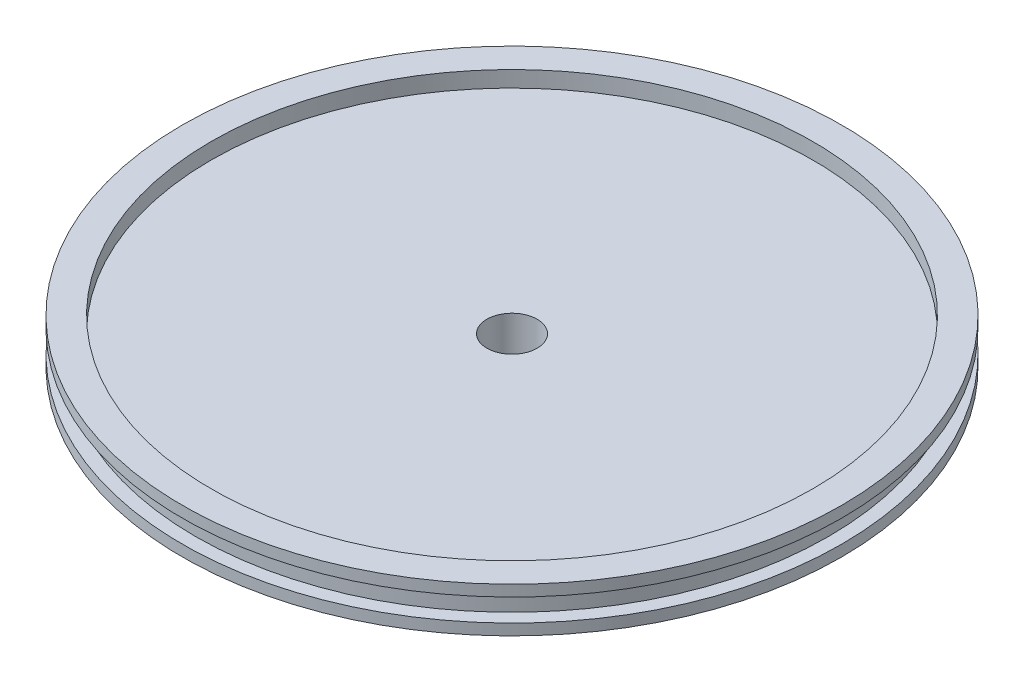
ISO-10303-21;
HEADER;
FILE_DESCRIPTION(('STEP AP214'),'2;1');
FILE_NAME('part.step','',(''),(''),'','','');
FILE_SCHEMA(('AUTOMOTIVE_DESIGN { 1 0 10303 214 1 1 1 1 }'));
ENDSEC;
DATA;
#1=APPLICATION_CONTEXT('core data for automotive mechanical design processes');
#2=APPLICATION_PROTOCOL_DEFINITION('international standard','automotive_design',2000,#1);
#3=PRODUCT_CONTEXT('',#1,'mechanical');
#4=PRODUCT('Part','Part','',(#3));
#5=PRODUCT_RELATED_PRODUCT_CATEGORY('part','',(#4));
#6=PRODUCT_DEFINITION_FORMATION('','',#4);
#7=PRODUCT_DEFINITION_CONTEXT('part definition',#1,'design');
#8=PRODUCT_DEFINITION('design','',#6,#7);
#9=PRODUCT_DEFINITION_SHAPE('','',#8);
#10=(LENGTH_UNIT() NAMED_UNIT(*) SI_UNIT(.MILLI.,.METRE.));
#11=(NAMED_UNIT(*) PLANE_ANGLE_UNIT() SI_UNIT($,.RADIAN.));
#12=(NAMED_UNIT(*) SI_UNIT($,.STERADIAN.) SOLID_ANGLE_UNIT());
#13=UNCERTAINTY_MEASURE_WITH_UNIT(LENGTH_MEASURE(1.E-05),#10,'distance_accuracy_value','');
#14=(GEOMETRIC_REPRESENTATION_CONTEXT(3) GLOBAL_UNCERTAINTY_ASSIGNED_CONTEXT((#13)) GLOBAL_UNIT_ASSIGNED_CONTEXT((#10,
#11,#12)) REPRESENTATION_CONTEXT('',''));
#15=CARTESIAN_POINT('',(0.,0.,0.));
#16=DIRECTION('',(0.,0.,1.));
#17=DIRECTION('',(1.,0.,0.));
#18=AXIS2_PLACEMENT_3D('',#15,#16,#17);
#19=CARTESIAN_POINT('',(0.,-2.54,0.));
#20=DIRECTION('',(0.,-1.,0.));
#21=DIRECTION('',(1.,0.,0.));
#22=AXIS2_PLACEMENT_3D('',#19,#20,#21);
#23=PLANE('',#22);
#24=CARTESIAN_POINT('',(0.,-2.54,0.));
#25=DIRECTION('',(0.,-1.,0.));
#26=DIRECTION('',(1.,0.,0.));
#27=AXIS2_PLACEMENT_3D('',#24,#25,#26);
#28=CIRCLE('',#27,66.04);
#29=CARTESIAN_POINT('',(66.04,-2.53999999999999,0.));
#30=VERTEX_POINT('',#29);
#31=EDGE_CURVE('E60',#30,#30,#28,.T.);
#32=ORIENTED_EDGE('',*,*,#31,.T.);
#33=EDGE_LOOP('',(#32));
#34=FACE_BOUND('',#33,.T.);
#35=CARTESIAN_POINT('',(0.,-2.54,0.));
#36=DIRECTION('',(0.,1.,0.));
#37=DIRECTION('',(0.,0.,1.));
#38=AXIS2_PLACEMENT_3D('',#35,#36,#37);
#39=CIRCLE('',#38,5.5626);
#40=CARTESIAN_POINT('',(0.,-2.54,5.5626));
#41=VERTEX_POINT('',#40);
#42=EDGE_CURVE('E202',#41,#41,#39,.T.);
#43=ORIENTED_EDGE('',*,*,#42,.T.);
#44=EDGE_LOOP('',(#43));
#45=FACE_BOUND('',#44,.T.);
#46=ADVANCED_FACE('F43',(#34,#45),#23,.T.);
#47=CARTESIAN_POINT('',(0.,0.,0.));
#48=DIRECTION('',(0.,1.,0.));
#49=DIRECTION('',(-1.,0.,0.));
#50=AXIS2_PLACEMENT_3D('',#47,#48,#49);
#51=PLANE('',#50);
#52=CARTESIAN_POINT('',(0.,0.,0.));
#53=DIRECTION('',(0.,-1.,0.));
#54=DIRECTION('',(1.,0.,0.));
#55=AXIS2_PLACEMENT_3D('',#52,#53,#54);
#56=CIRCLE('',#55,66.04);
#57=CARTESIAN_POINT('',(66.04,0.,0.));
#58=VERTEX_POINT('',#57);
#59=EDGE_CURVE('E10',#58,#58,#56,.T.);
#60=ORIENTED_EDGE('',*,*,#59,.F.);
#61=EDGE_LOOP('',(#60));
#62=FACE_BOUND('',#61,.T.);
#63=CARTESIAN_POINT('',(0.,0.,0.));
#64=DIRECTION('',(0.,1.,0.));
#65=DIRECTION('',(-1.,0.,0.));
#66=AXIS2_PLACEMENT_3D('',#63,#64,#65);
#67=CIRCLE('',#66,72.898);
#68=CARTESIAN_POINT('',(-72.898,0.,0.));
#69=VERTEX_POINT('',#68);
#70=EDGE_CURVE('E47',#69,#69,#67,.T.);
#71=ORIENTED_EDGE('',*,*,#70,.F.);
#72=EDGE_LOOP('',(#71));
#73=FACE_BOUND('',#72,.T.);
#74=ADVANCED_FACE('F45',(#62,#73),#51,.F.);
#75=CARTESIAN_POINT('',(0.,48.1922132313012,0.));
#76=DIRECTION('',(0.,1.,0.));
#77=DIRECTION('',(-1.,0.,0.));
#78=AXIS2_PLACEMENT_3D('',#75,#76,#77);
#79=CYLINDRICAL_SURFACE('',#78,72.898);
#80=CARTESIAN_POINT('',(0.,2.4638,0.));
#81=DIRECTION('',(0.,1.,0.));
#82=DIRECTION('',(-1.,0.,0.));
#83=AXIS2_PLACEMENT_3D('',#80,#81,#82);
#84=CIRCLE('',#83,72.898);
#85=CARTESIAN_POINT('',(-72.898,2.46379999999999,0.));
#86=VERTEX_POINT('',#85);
#87=EDGE_CURVE('E57',#86,#86,#84,.T.);
#88=ORIENTED_EDGE('',*,*,#87,.F.);
#89=EDGE_LOOP('',(#88));
#90=FACE_BOUND('',#89,.T.);
#91=ORIENTED_EDGE('',*,*,#70,.T.);
#92=EDGE_LOOP('',(#91));
#93=FACE_BOUND('',#92,.T.);
#94=ADVANCED_FACE('F91',(#90,#93),#79,.T.);
#95=CARTESIAN_POINT('',(72.898,2.4638,0.));
#96=DIRECTION('',(0.,-1.,0.));
#97=DIRECTION('',(1.,0.,0.));
#98=AXIS2_PLACEMENT_3D('',#95,#96,#97);
#99=PLANE('',#98);
#100=CARTESIAN_POINT('',(0.,2.4638,0.));
#101=DIRECTION('',(0.,1.,0.));
#102=DIRECTION('',(-1.,0.,0.));
#103=AXIS2_PLACEMENT_3D('',#100,#101,#102);
#104=CIRCLE('',#103,69.977);
#105=CARTESIAN_POINT('',(-69.977,2.46379999999999,0.));
#106=VERTEX_POINT('',#105);
#107=EDGE_CURVE('E82',#106,#106,#104,.T.);
#108=ORIENTED_EDGE('',*,*,#107,.F.);
#109=EDGE_LOOP('',(#108));
#110=FACE_BOUND('',#109,.T.);
#111=ORIENTED_EDGE('',*,*,#87,.T.);
#112=EDGE_LOOP('',(#111));
#113=FACE_BOUND('',#112,.T.);
#114=ADVANCED_FACE('F89',(#110,#113),#99,.F.);
#115=CARTESIAN_POINT('',(0.,48.1922132313012,0.));
#116=DIRECTION('',(0.,1.,0.));
#117=DIRECTION('',(-1.,0.,0.));
#118=AXIS2_PLACEMENT_3D('',#115,#116,#117);
#119=CYLINDRICAL_SURFACE('',#118,69.977);
#120=CARTESIAN_POINT('',(0.,7.44219999999999,0.));
#121=DIRECTION('',(0.,1.,0.));
#122=DIRECTION('',(-1.,0.,0.));
#123=AXIS2_PLACEMENT_3D('',#120,#121,#122);
#124=CIRCLE('',#123,69.977);
#125=CARTESIAN_POINT('',(-69.977,7.44219999999998,0.));
#126=VERTEX_POINT('',#125);
#127=EDGE_CURVE('E78',#126,#126,#124,.T.);
#128=ORIENTED_EDGE('',*,*,#127,.F.);
#129=EDGE_LOOP('',(#128));
#130=FACE_BOUND('',#129,.T.);
#131=ORIENTED_EDGE('',*,*,#107,.T.);
#132=EDGE_LOOP('',(#131));
#133=FACE_BOUND('',#132,.T.);
#134=ADVANCED_FACE('F133',(#130,#133),#119,.T.);
#135=CARTESIAN_POINT('',(69.977,7.4422,0.));
#136=DIRECTION('',(0.,1.,0.));
#137=DIRECTION('',(-1.,0.,0.));
#138=AXIS2_PLACEMENT_3D('',#135,#136,#137);
#139=PLANE('',#138);
#140=CARTESIAN_POINT('',(0.,7.44219999999999,0.));
#141=DIRECTION('',(0.,1.,0.));
#142=DIRECTION('',(-1.,0.,0.));
#143=AXIS2_PLACEMENT_3D('',#140,#141,#142);
#144=CIRCLE('',#143,72.898);
#145=CARTESIAN_POINT('',(-72.898,7.44219999999998,0.));
#146=VERTEX_POINT('',#145);
#147=EDGE_CURVE('E74',#146,#146,#144,.T.);
#148=ORIENTED_EDGE('',*,*,#147,.F.);
#149=EDGE_LOOP('',(#148));
#150=FACE_BOUND('',#149,.T.);
#151=ORIENTED_EDGE('',*,*,#127,.T.);
#152=EDGE_LOOP('',(#151));
#153=FACE_BOUND('',#152,.T.);
#154=ADVANCED_FACE('F129',(#150,#153),#139,.F.);
#155=CARTESIAN_POINT('',(0.,48.1922132313012,0.));
#156=DIRECTION('',(0.,1.,0.));
#157=DIRECTION('',(-1.,0.,0.));
#158=AXIS2_PLACEMENT_3D('',#155,#156,#157);
#159=CYLINDRICAL_SURFACE('',#158,72.898);
#160=CARTESIAN_POINT('',(0.,9.90599999999999,0.));
#161=DIRECTION('',(0.,1.,0.));
#162=DIRECTION('',(-1.,0.,0.));
#163=AXIS2_PLACEMENT_3D('',#160,#161,#162);
#164=CIRCLE('',#163,72.898);
#165=CARTESIAN_POINT('',(-72.898,9.90599999999998,0.));
#166=VERTEX_POINT('',#165);
#167=EDGE_CURVE('E70',#166,#166,#164,.T.);
#168=ORIENTED_EDGE('',*,*,#167,.F.);
#169=EDGE_LOOP('',(#168));
#170=FACE_BOUND('',#169,.T.);
#171=ORIENTED_EDGE('',*,*,#147,.T.);
#172=EDGE_LOOP('',(#171));
#173=FACE_BOUND('',#172,.T.);
#174=ADVANCED_FACE('F125',(#170,#173),#159,.T.);
#175=CARTESIAN_POINT('',(72.898,9.906,0.));
#176=DIRECTION('',(0.,-1.,0.));
#177=DIRECTION('',(1.,0.,0.));
#178=AXIS2_PLACEMENT_3D('',#175,#176,#177);
#179=PLANE('',#178);
#180=CARTESIAN_POINT('',(0.,9.90599999999999,0.));
#181=DIRECTION('',(0.,1.,0.));
#182=DIRECTION('',(-1.,0.,0.));
#183=AXIS2_PLACEMENT_3D('',#180,#181,#182);
#184=CIRCLE('',#183,66.548);
#185=CARTESIAN_POINT('',(-66.548,9.90599999999998,0.));
#186=VERTEX_POINT('',#185);
#187=EDGE_CURVE('E66',#186,#186,#184,.T.);
#188=ORIENTED_EDGE('',*,*,#187,.F.);
#189=EDGE_LOOP('',(#188));
#190=FACE_BOUND('',#189,.T.);
#191=ORIENTED_EDGE('',*,*,#167,.T.);
#192=EDGE_LOOP('',(#191));
#193=FACE_BOUND('',#192,.T.);
#194=ADVANCED_FACE('F121',(#190,#193),#179,.F.);
#195=CARTESIAN_POINT('',(0.,48.1922132313012,0.));
#196=DIRECTION('',(0.,1.,0.));
#197=DIRECTION('',(-1.,0.,0.));
#198=AXIS2_PLACEMENT_3D('',#195,#196,#197);
#199=CYLINDRICAL_SURFACE('',#198,66.548);
#200=CARTESIAN_POINT('',(0.,6.34999999999999,0.));
#201=DIRECTION('',(0.,1.,0.));
#202=DIRECTION('',(-1.,0.,0.));
#203=AXIS2_PLACEMENT_3D('',#200,#201,#202);
#204=CIRCLE('',#203,66.548);
#205=CARTESIAN_POINT('',(-66.548,6.34999999999999,0.));
#206=VERTEX_POINT('',#205);
#207=EDGE_CURVE('E62',#206,#206,#204,.T.);
#208=ORIENTED_EDGE('',*,*,#207,.F.);
#209=EDGE_LOOP('',(#208));
#210=FACE_BOUND('',#209,.T.);
#211=ORIENTED_EDGE('',*,*,#187,.T.);
#212=EDGE_LOOP('',(#211));
#213=FACE_BOUND('',#212,.T.);
#214=ADVANCED_FACE('F118',(#210,#213),#199,.F.);
#215=CARTESIAN_POINT('',(66.548,6.35,0.));
#216=DIRECTION('',(0.,-1.,0.));
#217=DIRECTION('',(1.,0.,0.));
#218=AXIS2_PLACEMENT_3D('',#215,#216,#217);
#219=PLANE('',#218);
#220=CARTESIAN_POINT('',(0.,6.35,0.));
#221=DIRECTION('',(0.,1.,0.));
#222=DIRECTION('',(0.,0.,1.));
#223=AXIS2_PLACEMENT_3D('',#220,#221,#222);
#224=CIRCLE('',#223,5.56259999999999);
#225=CARTESIAN_POINT('',(0.,6.35,5.56259999999999));
#226=VERTEX_POINT('',#225);
#227=EDGE_CURVE('E205',#226,#226,#224,.T.);
#228=ORIENTED_EDGE('',*,*,#227,.F.);
#229=EDGE_LOOP('',(#228));
#230=FACE_BOUND('',#229,.T.);
#231=ORIENTED_EDGE('',*,*,#207,.T.);
#232=EDGE_LOOP('',(#231));
#233=FACE_BOUND('',#232,.T.);
#234=ADVANCED_FACE('F115',(#230,#233),#219,.F.);
#235=CARTESIAN_POINT('',(0.,-2.54,0.));
#236=DIRECTION('',(0.,1.,0.));
#237=DIRECTION('',(-1.,0.,0.));
#238=AXIS2_PLACEMENT_3D('',#235,#236,#237);
#239=CYLINDRICAL_SURFACE('',#238,66.04);
#240=ORIENTED_EDGE('',*,*,#31,.F.);
#241=EDGE_LOOP('',(#240));
#242=FACE_BOUND('',#241,.T.);
#243=ORIENTED_EDGE('',*,*,#59,.T.);
#244=EDGE_LOOP('',(#243));
#245=FACE_BOUND('',#244,.T.);
#246=ADVANCED_FACE('F113',(#242,#245),#239,.T.);
#247=CARTESIAN_POINT('',(0.,6.35,0.));
#248=DIRECTION('',(0.,1.,0.));
#249=DIRECTION('',(0.,0.,1.));
#250=AXIS2_PLACEMENT_3D('',#247,#248,#249);
#251=CYLINDRICAL_SURFACE('',#250,5.56259999999999);
#252=ORIENTED_EDGE('',*,*,#42,.F.);
#253=EDGE_LOOP('',(#252));
#254=FACE_BOUND('',#253,.T.);
#255=ORIENTED_EDGE('',*,*,#227,.T.);
#256=EDGE_LOOP('',(#255));
#257=FACE_BOUND('',#256,.T.);
#258=ADVANCED_FACE('F112',(#254,#257),#251,.F.);
#259=CLOSED_SHELL('',(#46,#74,#94,#114,#134,#154,#174,#194,#214,#234,#246,#258));
#260=MANIFOLD_SOLID_BREP('B2',#259);
#261=ADVANCED_BREP_SHAPE_REPRESENTATION('',(#18,#260),#14);
#262=SHAPE_DEFINITION_REPRESENTATION(#9,#261);
ENDSEC;
END-ISO-10303-21;
